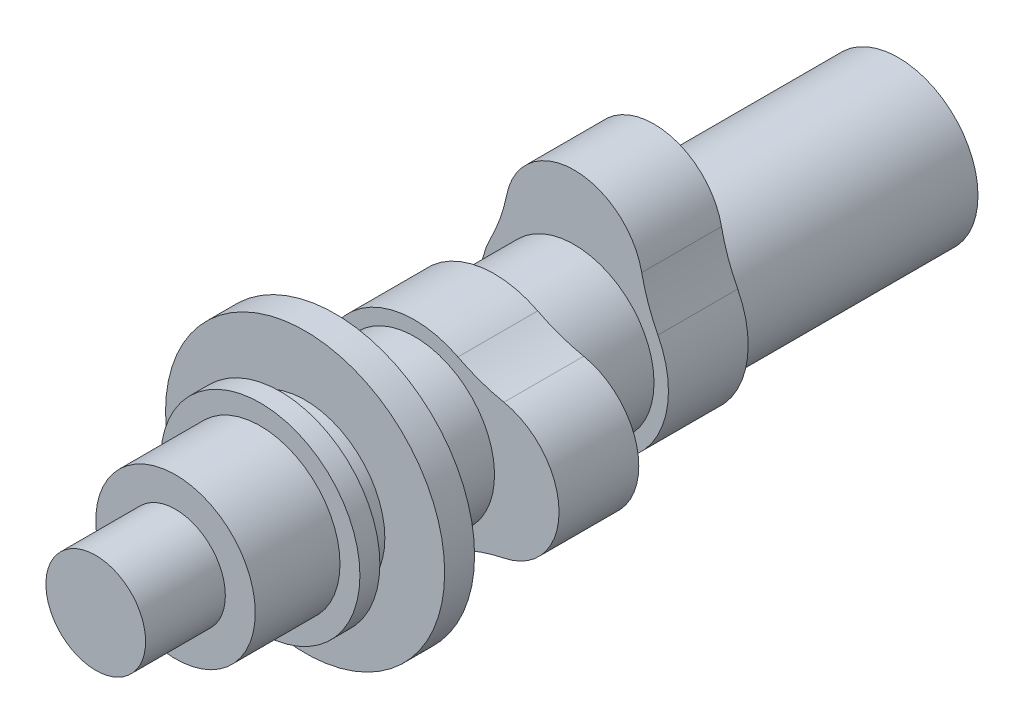
ISO-10303-21;
HEADER;
FILE_DESCRIPTION(('STEP AP214'),'2;1');
FILE_NAME('part.step','',(''),(''),'','','');
FILE_SCHEMA(('AUTOMOTIVE_DESIGN { 1 0 10303 214 1 1 1 1 }'));
ENDSEC;
DATA;
#1=APPLICATION_CONTEXT('core data for automotive mechanical design processes');
#2=APPLICATION_PROTOCOL_DEFINITION('international standard','automotive_design',2000,#1);
#3=PRODUCT_CONTEXT('',#1,'mechanical');
#4=PRODUCT('Part','Part','',(#3));
#5=PRODUCT_RELATED_PRODUCT_CATEGORY('part','',(#4));
#6=PRODUCT_DEFINITION_FORMATION('','',#4);
#7=PRODUCT_DEFINITION_CONTEXT('part definition',#1,'design');
#8=PRODUCT_DEFINITION('design','',#6,#7);
#9=PRODUCT_DEFINITION_SHAPE('','',#8);
#10=(LENGTH_UNIT() NAMED_UNIT(*) SI_UNIT(.MILLI.,.METRE.));
#11=(NAMED_UNIT(*) PLANE_ANGLE_UNIT() SI_UNIT($,.RADIAN.));
#12=(NAMED_UNIT(*) SI_UNIT($,.STERADIAN.) SOLID_ANGLE_UNIT());
#13=UNCERTAINTY_MEASURE_WITH_UNIT(LENGTH_MEASURE(1.E-05),#10,'distance_accuracy_value','');
#14=(GEOMETRIC_REPRESENTATION_CONTEXT(3) GLOBAL_UNCERTAINTY_ASSIGNED_CONTEXT((#13)) GLOBAL_UNIT_ASSIGNED_CONTEXT((#10,
#11,#12)) REPRESENTATION_CONTEXT('',''));
#15=CARTESIAN_POINT('',(0.,0.,0.));
#16=DIRECTION('',(0.,0.,1.));
#17=DIRECTION('',(1.,0.,0.));
#18=AXIS2_PLACEMENT_3D('',#15,#16,#17);
#19=CARTESIAN_POINT('',(0.,0.,76.2));
#20=DIRECTION('',(0.,0.,-1.));
#21=DIRECTION('',(-1.,0.,0.));
#22=AXIS2_PLACEMENT_3D('',#19,#20,#21);
#23=CYLINDRICAL_SURFACE('',#22,12.7);
#24=CARTESIAN_POINT('',(0.,0.,55.5625));
#25=DIRECTION('',(0.,0.,1.));
#26=DIRECTION('',(1.,0.,0.));
#27=AXIS2_PLACEMENT_3D('',#24,#25,#26);
#28=CIRCLE('',#27,12.7);
#29=CARTESIAN_POINT('',(12.7,0.,55.5625));
#30=VERTEX_POINT('',#29);
#31=EDGE_CURVE('E182',#30,#30,#28,.T.);
#32=ORIENTED_EDGE('',*,*,#31,.T.);
#33=EDGE_LOOP('',(#32));
#34=FACE_BOUND('',#33,.T.);
#35=CARTESIAN_POINT('',(0.,0.,59.53125));
#36=DIRECTION('',(0.,0.,1.));
#37=DIRECTION('',(1.,0.,0.));
#38=AXIS2_PLACEMENT_3D('',#35,#36,#37);
#39=CIRCLE('',#38,12.7);
#40=CARTESIAN_POINT('',(12.7,0.,59.53125));
#41=VERTEX_POINT('',#40);
#42=EDGE_CURVE('E37',#41,#41,#39,.T.);
#43=ORIENTED_EDGE('',*,*,#42,.F.);
#44=EDGE_LOOP('',(#43));
#45=FACE_BOUND('',#44,.T.);
#46=ADVANCED_FACE('F33',(#34,#45),#23,.T.);
#47=CARTESIAN_POINT('',(0.,0.,38.0999999999998));
#48=DIRECTION('',(0.,0.,1.));
#49=DIRECTION('',(0.,-1.,0.));
#50=AXIS2_PLACEMENT_3D('',#47,#48,#49);
#51=CIRCLE('',#50,12.7);
#52=CARTESIAN_POINT('',(0.,-12.7,38.0999999999996));
#53=VERTEX_POINT('',#52);
#54=EDGE_CURVE('E135',#53,#53,#51,.T.);
#55=ORIENTED_EDGE('',*,*,#54,.T.);
#56=EDGE_LOOP('',(#55));
#57=FACE_BOUND('',#56,.T.);
#58=CARTESIAN_POINT('',(0.,0.,50.8));
#59=DIRECTION('',(0.,0.,1.));
#60=DIRECTION('',(1.,0.,0.));
#61=AXIS2_PLACEMENT_3D('',#58,#59,#60);
#62=CIRCLE('',#61,12.7);
#63=CARTESIAN_POINT('',(12.7,0.,50.8));
#64=VERTEX_POINT('',#63);
#65=EDGE_CURVE('E178',#64,#64,#62,.T.);
#66=ORIENTED_EDGE('',*,*,#65,.F.);
#67=EDGE_LOOP('',(#66));
#68=FACE_BOUND('',#67,.T.);
#69=ADVANCED_FACE('F233',(#57,#68),#23,.T.);
#70=CARTESIAN_POINT('',(0.,0.,12.7));
#71=DIRECTION('',(0.,0.,1.));
#72=DIRECTION('',(1.,0.,0.));
#73=AXIS2_PLACEMENT_3D('',#70,#71,#72);
#74=CIRCLE('',#73,12.7);
#75=CARTESIAN_POINT('',(12.7,0.,12.7));
#76=VERTEX_POINT('',#75);
#77=EDGE_CURVE('E149',#76,#76,#74,.F.);
#78=ORIENTED_EDGE('',*,*,#77,.F.);
#79=EDGE_LOOP('',(#78));
#80=FACE_BOUND('',#79,.T.);
#81=CARTESIAN_POINT('',(0.,0.,25.3999999999998));
#82=DIRECTION('',(0.,0.,1.));
#83=DIRECTION('',(0.,-1.,0.));
#84=AXIS2_PLACEMENT_3D('',#81,#82,#83);
#85=CIRCLE('',#84,12.7);
#86=CARTESIAN_POINT('',(0.,-12.7,25.3999999999996));
#87=VERTEX_POINT('',#86);
#88=EDGE_CURVE('E176',#87,#87,#85,.T.);
#89=ORIENTED_EDGE('',*,*,#88,.F.);
#90=EDGE_LOOP('',(#89));
#91=FACE_BOUND('',#90,.T.);
#92=ADVANCED_FACE('F240',(#80,#91),#23,.T.);
#93=CARTESIAN_POINT('',(0.,12.0052209070083,12.7));
#94=DIRECTION('',(0.,0.,-1.));
#95=DIRECTION('',(-1.,0.,0.));
#96=AXIS2_PLACEMENT_3D('',#93,#94,#95);
#97=CYLINDRICAL_SURFACE('',#96,10.9690790929917);
#98=CARTESIAN_POINT('',(0.,12.0052209070083,0.));
#99=DIRECTION('',(0.,0.,1.));
#100=DIRECTION('',(1.,0.,0.));
#101=AXIS2_PLACEMENT_3D('',#98,#99,#100);
#102=CIRCLE('',#101,10.9690790929917);
#103=CARTESIAN_POINT('',(10.7465616100147,14.2034269279413,0.));
#104=VERTEX_POINT('',#103);
#105=CARTESIAN_POINT('',(-10.7465616100147,14.2034269279413,0.));
#106=VERTEX_POINT('',#105);
#107=EDGE_CURVE('E152',#104,#106,#102,.T.);
#108=ORIENTED_EDGE('',*,*,#107,.T.);
#109=DIRECTION('',(0.,0.,-1.));
#110=VECTOR('',#109,1.);
#111=CARTESIAN_POINT('',(-10.7465616100147,14.2034269279413,12.7));
#112=LINE('',#111,#110);
#113=CARTESIAN_POINT('',(-10.7465616100147,14.2034269279413,12.7));
#114=VERTEX_POINT('',#113);
#115=EDGE_CURVE('E171',#114,#106,#112,.T.);
#116=ORIENTED_EDGE('',*,*,#115,.F.);
#117=CARTESIAN_POINT('',(0.,12.0052209070083,12.7));
#118=DIRECTION('',(0.,0.,1.));
#119=DIRECTION('',(1.,0.,0.));
#120=AXIS2_PLACEMENT_3D('',#117,#118,#119);
#121=CIRCLE('',#120,10.9690790929917);
#122=CARTESIAN_POINT('',(10.7465616100147,14.2034269279413,12.7));
#123=VERTEX_POINT('',#122);
#124=EDGE_CURVE('E153',#123,#114,#121,.T.);
#125=ORIENTED_EDGE('',*,*,#124,.F.);
#126=DIRECTION('',(0.,0.,-1.));
#127=VECTOR('',#126,1.);
#128=CARTESIAN_POINT('',(10.7465616100147,14.2034269279413,12.7));
#129=LINE('',#128,#127);
#130=EDGE_CURVE('E159',#123,#104,#129,.T.);
#131=ORIENTED_EDGE('',*,*,#130,.T.);
#132=EDGE_LOOP('',(#108,#116,#125,#131));
#133=FACE_BOUND('',#132,.T.);
#134=ADVANCED_FACE('F35',(#133),#97,.T.);
#135=CARTESIAN_POINT('',(-38.5809051714069,19.8969337281399,12.7));
#136=DIRECTION('',(0.,0.,-1.));
#137=DIRECTION('',(-1.,0.,0.));
#138=AXIS2_PLACEMENT_3D('',#135,#136,#137);
#139=CYLINDRICAL_SURFACE('',#138,28.4106793508625);
#140=CARTESIAN_POINT('',(-38.5809051714069,19.8969337281399,0.));
#141=DIRECTION('',(0.,0.,-1.));
#142=DIRECTION('',(-1.,0.,0.));
#143=AXIS2_PLACEMENT_3D('',#140,#141,#142);
#144=CIRCLE('',#143,28.4106793508625);
#145=CARTESIAN_POINT('',(-13.3303776982677,6.87473869405422,0.));
#146=VERTEX_POINT('',#145);
#147=EDGE_CURVE('E162',#106,#146,#144,.T.);
#148=ORIENTED_EDGE('',*,*,#147,.T.);
#149=DIRECTION('',(0.,0.,-1.));
#150=VECTOR('',#149,1.);
#151=CARTESIAN_POINT('',(-13.3303776982677,6.87473869405422,12.7));
#152=LINE('',#151,#150);
#153=CARTESIAN_POINT('',(-13.3303776982677,6.87473869405422,12.7));
#154=VERTEX_POINT('',#153);
#155=EDGE_CURVE('E169',#154,#146,#152,.T.);
#156=ORIENTED_EDGE('',*,*,#155,.F.);
#157=CARTESIAN_POINT('',(-38.5809051714069,19.8969337281399,12.7));
#158=DIRECTION('',(0.,0.,-1.));
#159=DIRECTION('',(-1.,0.,0.));
#160=AXIS2_PLACEMENT_3D('',#157,#158,#159);
#161=CIRCLE('',#160,28.4106793508625);
#162=EDGE_CURVE('E83',#114,#154,#161,.T.);
#163=ORIENTED_EDGE('',*,*,#162,.F.);
#164=ORIENTED_EDGE('',*,*,#115,.T.);
#165=EDGE_LOOP('',(#148,#156,#163,#164));
#166=FACE_BOUND('',#165,.T.);
#167=ADVANCED_FACE('F276',(#166),#139,.F.);
#168=CARTESIAN_POINT('',(0.,0.,12.7));
#169=DIRECTION('',(0.,0.,-1.));
#170=DIRECTION('',(-1.,0.,0.));
#171=AXIS2_PLACEMENT_3D('',#168,#169,#170);
#172=CYLINDRICAL_SURFACE('',#171,14.9987);
#173=CARTESIAN_POINT('',(0.,0.,0.));
#174=DIRECTION('',(0.,0.,1.));
#175=DIRECTION('',(1.,0.,0.));
#176=AXIS2_PLACEMENT_3D('',#173,#174,#175);
#177=CIRCLE('',#176,14.9987);
#178=CARTESIAN_POINT('',(13.3303776982677,6.87473869405421,0.));
#179=VERTEX_POINT('',#178);
#180=EDGE_CURVE('E69',#146,#179,#177,.T.);
#181=ORIENTED_EDGE('',*,*,#180,.T.);
#182=DIRECTION('',(0.,0.,-1.));
#183=VECTOR('',#182,1.);
#184=CARTESIAN_POINT('',(13.3303776982677,6.87473869405421,12.7));
#185=LINE('',#184,#183);
#186=CARTESIAN_POINT('',(13.3303776982677,6.87473869405421,12.7));
#187=VERTEX_POINT('',#186);
#188=EDGE_CURVE('E167',#187,#179,#185,.T.);
#189=ORIENTED_EDGE('',*,*,#188,.F.);
#190=CARTESIAN_POINT('',(0.,0.,12.7));
#191=DIRECTION('',(0.,0.,1.));
#192=DIRECTION('',(1.,0.,0.));
#193=AXIS2_PLACEMENT_3D('',#190,#191,#192);
#194=CIRCLE('',#193,14.9987);
#195=EDGE_CURVE('E156',#154,#187,#194,.T.);
#196=ORIENTED_EDGE('',*,*,#195,.F.);
#197=ORIENTED_EDGE('',*,*,#155,.T.);
#198=EDGE_LOOP('',(#181,#189,#196,#197));
#199=FACE_BOUND('',#198,.T.);
#200=ADVANCED_FACE('F456',(#199),#172,.T.);
#201=CARTESIAN_POINT('',(38.5809051714069,19.8969337281399,12.7));
#202=DIRECTION('',(0.,0.,-1.));
#203=DIRECTION('',(-1.,0.,0.));
#204=AXIS2_PLACEMENT_3D('',#201,#202,#203);
#205=CYLINDRICAL_SURFACE('',#204,28.4106793508625);
#206=CARTESIAN_POINT('',(38.5809051714069,19.8969337281399,0.));
#207=DIRECTION('',(0.,0.,-1.));
#208=DIRECTION('',(1.,0.,0.));
#209=AXIS2_PLACEMENT_3D('',#206,#207,#208);
#210=CIRCLE('',#209,28.4106793508625);
#211=EDGE_CURVE('E75',#179,#104,#210,.T.);
#212=ORIENTED_EDGE('',*,*,#211,.T.);
#213=ORIENTED_EDGE('',*,*,#130,.F.);
#214=CARTESIAN_POINT('',(38.5809051714069,19.8969337281399,12.7));
#215=DIRECTION('',(0.,0.,-1.));
#216=DIRECTION('',(1.,0.,0.));
#217=AXIS2_PLACEMENT_3D('',#214,#215,#216);
#218=CIRCLE('',#217,28.4106793508625);
#219=EDGE_CURVE('E51',#187,#123,#218,.T.);
#220=ORIENTED_EDGE('',*,*,#219,.F.);
#221=ORIENTED_EDGE('',*,*,#188,.T.);
#222=EDGE_LOOP('',(#212,#213,#220,#221));
#223=FACE_BOUND('',#222,.T.);
#224=ADVANCED_FACE('F447',(#223),#205,.F.);
#225=CARTESIAN_POINT('',(-19.2904525857035,15.9510773175741,12.7));
#226=DIRECTION('',(0.,0.,1.));
#227=DIRECTION('',(1.,0.,0.));
#228=AXIS2_PLACEMENT_3D('',#225,#226,#227);
#229=PLANE('',#228);
#230=ORIENTED_EDGE('',*,*,#77,.T.);
#231=EDGE_LOOP('',(#230));
#232=FACE_BOUND('',#231,.T.);
#233=ORIENTED_EDGE('',*,*,#124,.T.);
#234=ORIENTED_EDGE('',*,*,#162,.T.);
#235=ORIENTED_EDGE('',*,*,#195,.T.);
#236=ORIENTED_EDGE('',*,*,#219,.T.);
#237=EDGE_LOOP('',(#233,#234,#235,#236));
#238=FACE_BOUND('',#237,.T.);
#239=ADVANCED_FACE('F437',(#232,#238),#229,.T.);
#240=CARTESIAN_POINT('',(-19.2904525857035,15.9510773175741,0.));
#241=DIRECTION('',(0.,0.,1.));
#242=DIRECTION('',(1.,0.,0.));
#243=AXIS2_PLACEMENT_3D('',#240,#241,#242);
#244=PLANE('',#243);
#245=CARTESIAN_POINT('',(0.,0.,0.));
#246=DIRECTION('',(0.,0.,1.));
#247=DIRECTION('',(1.,0.,0.));
#248=AXIS2_PLACEMENT_3D('',#245,#246,#247);
#249=CIRCLE('',#248,12.7);
#250=CARTESIAN_POINT('',(12.7,0.,0.));
#251=VERTEX_POINT('',#250);
#252=EDGE_CURVE('E173',#251,#251,#249,.F.);
#253=ORIENTED_EDGE('',*,*,#252,.F.);
#254=EDGE_LOOP('',(#253));
#255=FACE_BOUND('',#254,.T.);
#256=ORIENTED_EDGE('',*,*,#107,.F.);
#257=ORIENTED_EDGE('',*,*,#211,.F.);
#258=ORIENTED_EDGE('',*,*,#180,.F.);
#259=ORIENTED_EDGE('',*,*,#147,.F.);
#260=EDGE_LOOP('',(#256,#257,#258,#259));
#261=FACE_BOUND('',#260,.T.);
#262=ADVANCED_FACE('F267',(#255,#261),#244,.F.);
#263=CARTESIAN_POINT('',(0.,0.,-38.89375));
#264=DIRECTION('',(0.,0.,1.));
#265=DIRECTION('',(1.,0.,0.));
#266=AXIS2_PLACEMENT_3D('',#263,#264,#265);
#267=PLANE('',#266);
#268=CARTESIAN_POINT('',(0.,0.,-38.89375));
#269=DIRECTION('',(0.,0.,1.));
#270=DIRECTION('',(1.,0.,0.));
#271=AXIS2_PLACEMENT_3D('',#268,#269,#270);
#272=CIRCLE('',#271,12.7);
#273=CARTESIAN_POINT('',(12.7,0.,-38.89375));
#274=VERTEX_POINT('',#273);
#275=EDGE_CURVE('E138',#274,#274,#272,.T.);
#276=ORIENTED_EDGE('',*,*,#275,.F.);
#277=EDGE_LOOP('',(#276));
#278=FACE_BOUND('',#277,.T.);
#279=ADVANCED_FACE('F260',(#278),#267,.F.);
#280=ORIENTED_EDGE('',*,*,#275,.T.);
#281=EDGE_LOOP('',(#280));
#282=FACE_BOUND('',#281,.T.);
#283=ORIENTED_EDGE('',*,*,#252,.T.);
#284=EDGE_LOOP('',(#283));
#285=FACE_BOUND('',#284,.T.);
#286=ADVANCED_FACE('F248',(#282,#285),#23,.T.);
#287=CARTESIAN_POINT('',(12.0052209070083,0.,38.0999999999999));
#288=DIRECTION('',(0.,0.,-1.));
#289=DIRECTION('',(0.,1.,0.));
#290=AXIS2_PLACEMENT_3D('',#287,#288,#289);
#291=CYLINDRICAL_SURFACE('',#290,10.9690790929917);
#292=CARTESIAN_POINT('',(12.0052209070083,1.26543262044327E-13,25.3999999999998));
#293=DIRECTION('',(0.,0.,1.));
#294=DIRECTION('',(0.,-1.,0.));
#295=AXIS2_PLACEMENT_3D('',#292,#293,#294);
#296=CIRCLE('',#295,10.9690790929917);
#297=CARTESIAN_POINT('',(14.2034269279413,-10.7465616100146,25.3999999999997));
#298=VERTEX_POINT('',#297);
#299=CARTESIAN_POINT('',(14.2034269279414,10.7465616100148,25.4));
#300=VERTEX_POINT('',#299);
#301=EDGE_CURVE('E134',#298,#300,#296,.T.);
#302=ORIENTED_EDGE('',*,*,#301,.T.);
#303=DIRECTION('',(0.,0.,-1.));
#304=VECTOR('',#303,1.);
#305=CARTESIAN_POINT('',(14.2034269279414,10.7465616100147,38.1));
#306=LINE('',#305,#304);
#307=CARTESIAN_POINT('',(14.2034269279414,10.7465616100147,38.1));
#308=VERTEX_POINT('',#307);
#309=EDGE_CURVE('E114',#308,#300,#306,.T.);
#310=ORIENTED_EDGE('',*,*,#309,.F.);
#311=CARTESIAN_POINT('',(12.0052209070083,0.,38.0999999999999));
#312=DIRECTION('',(0.,0.,1.));
#313=DIRECTION('',(0.,-1.,0.));
#314=AXIS2_PLACEMENT_3D('',#311,#312,#313);
#315=CIRCLE('',#314,10.9690790929917);
#316=CARTESIAN_POINT('',(14.2034269279413,-10.7465616100148,38.0999999999997));
#317=VERTEX_POINT('',#316);
#318=EDGE_CURVE('E121',#317,#308,#315,.T.);
#319=ORIENTED_EDGE('',*,*,#318,.F.);
#320=DIRECTION('',(0.,0.,-1.));
#321=VECTOR('',#320,1.);
#322=CARTESIAN_POINT('',(14.2034269279413,-10.7465616100148,38.0999999999997));
#323=LINE('',#322,#321);
#324=EDGE_CURVE('E207',#317,#298,#323,.T.);
#325=ORIENTED_EDGE('',*,*,#324,.T.);
#326=EDGE_LOOP('',(#302,#310,#319,#325));
#327=FACE_BOUND('',#326,.T.);
#328=ADVANCED_FACE('F132',(#327),#291,.T.);
#329=CARTESIAN_POINT('',(19.8969337281401,38.5809051714069,38.1000000000004));
#330=DIRECTION('',(0.,0.,-1.));
#331=DIRECTION('',(0.,1.,0.));
#332=AXIS2_PLACEMENT_3D('',#329,#330,#331);
#333=CYLINDRICAL_SURFACE('',#332,28.4106793508625);
#334=CARTESIAN_POINT('',(19.8969337281401,38.580905171407,25.4000000000004));
#335=DIRECTION('',(0.,0.,-1.));
#336=DIRECTION('',(0.,1.,0.));
#337=AXIS2_PLACEMENT_3D('',#334,#335,#336);
#338=CIRCLE('',#337,28.4106793508625);
#339=CARTESIAN_POINT('',(6.87473869405431,13.3303776982679,25.4));
#340=VERTEX_POINT('',#339);
#341=EDGE_CURVE('E209',#300,#340,#338,.T.);
#342=ORIENTED_EDGE('',*,*,#341,.T.);
#343=DIRECTION('',(0.,0.,-1.));
#344=VECTOR('',#343,1.);
#345=CARTESIAN_POINT('',(6.87473869405427,13.3303776982677,38.1));
#346=LINE('',#345,#344);
#347=CARTESIAN_POINT('',(6.87473869405427,13.3303776982677,38.1));
#348=VERTEX_POINT('',#347);
#349=EDGE_CURVE('E117',#348,#340,#346,.T.);
#350=ORIENTED_EDGE('',*,*,#349,.F.);
#351=CARTESIAN_POINT('',(19.8969337281401,38.5809051714069,38.1000000000004));
#352=DIRECTION('',(0.,0.,-1.));
#353=DIRECTION('',(0.,1.,0.));
#354=AXIS2_PLACEMENT_3D('',#351,#352,#353);
#355=CIRCLE('',#354,28.4106793508625);
#356=EDGE_CURVE('E110',#308,#348,#355,.T.);
#357=ORIENTED_EDGE('',*,*,#356,.F.);
#358=ORIENTED_EDGE('',*,*,#309,.T.);
#359=EDGE_LOOP('',(#342,#350,#357,#358));
#360=FACE_BOUND('',#359,.T.);
#361=ADVANCED_FACE('F112',(#360),#333,.F.);
#362=CARTESIAN_POINT('',(0.,0.,38.0999999999998));
#363=DIRECTION('',(0.,0.,-1.));
#364=DIRECTION('',(0.,1.,0.));
#365=AXIS2_PLACEMENT_3D('',#362,#363,#364);
#366=CYLINDRICAL_SURFACE('',#365,14.9987);
#367=CARTESIAN_POINT('',(0.,1.74339709335669E-13,25.3999999999998));
#368=DIRECTION('',(0.,0.,1.));
#369=DIRECTION('',(0.,-1.,0.));
#370=AXIS2_PLACEMENT_3D('',#367,#368,#369);
#371=CIRCLE('',#370,14.9987);
#372=CARTESIAN_POINT('',(6.87473869405419,-13.3303776982676,25.3999999999997));
#373=VERTEX_POINT('',#372);
#374=EDGE_CURVE('E211',#340,#373,#371,.T.);
#375=ORIENTED_EDGE('',*,*,#374,.T.);
#376=DIRECTION('',(0.,0.,-1.));
#377=VECTOR('',#376,1.);
#378=CARTESIAN_POINT('',(6.87473869405415,-13.3303776982678,38.0999999999996));
#379=LINE('',#378,#377);
#380=CARTESIAN_POINT('',(6.87473869405415,-13.3303776982678,38.0999999999996));
#381=VERTEX_POINT('',#380);
#382=EDGE_CURVE('E140',#381,#373,#379,.T.);
#383=ORIENTED_EDGE('',*,*,#382,.F.);
#384=CARTESIAN_POINT('',(0.,0.,38.0999999999998));
#385=DIRECTION('',(0.,0.,1.));
#386=DIRECTION('',(0.,-1.,0.));
#387=AXIS2_PLACEMENT_3D('',#384,#385,#386);
#388=CIRCLE('',#387,14.9987);
#389=EDGE_CURVE('E120',#348,#381,#388,.T.);
#390=ORIENTED_EDGE('',*,*,#389,.F.);
#391=ORIENTED_EDGE('',*,*,#349,.T.);
#392=EDGE_LOOP('',(#375,#383,#390,#391));
#393=FACE_BOUND('',#392,.T.);
#394=ADVANCED_FACE('F223',(#393),#366,.T.);
#395=CARTESIAN_POINT('',(19.8969337281398,-38.580905171407,38.0999999999993));
#396=DIRECTION('',(0.,0.,-1.));
#397=DIRECTION('',(0.,1.,0.));
#398=AXIS2_PLACEMENT_3D('',#395,#396,#397);
#399=CYLINDRICAL_SURFACE('',#398,28.4106793508625);
#400=CARTESIAN_POINT('',(19.8969337281398,-38.5809051714068,25.3999999999993));
#401=DIRECTION('',(0.,0.,-1.));
#402=DIRECTION('',(0.,-1.,0.));
#403=AXIS2_PLACEMENT_3D('',#400,#401,#402);
#404=CIRCLE('',#403,28.4106793508625);
#405=EDGE_CURVE('E130',#373,#298,#404,.T.);
#406=ORIENTED_EDGE('',*,*,#405,.T.);
#407=ORIENTED_EDGE('',*,*,#324,.F.);
#408=CARTESIAN_POINT('',(19.8969337281398,-38.580905171407,38.0999999999993));
#409=DIRECTION('',(0.,0.,-1.));
#410=DIRECTION('',(0.,-1.,0.));
#411=AXIS2_PLACEMENT_3D('',#408,#409,#410);
#412=CIRCLE('',#411,28.4106793508625);
#413=EDGE_CURVE('E126',#381,#317,#412,.T.);
#414=ORIENTED_EDGE('',*,*,#413,.F.);
#415=ORIENTED_EDGE('',*,*,#382,.T.);
#416=EDGE_LOOP('',(#406,#407,#414,#415));
#417=FACE_BOUND('',#416,.T.);
#418=ADVANCED_FACE('F218',(#417),#399,.F.);
#419=CARTESIAN_POINT('',(15.9510773175742,19.2904525857034,38.1000000000001));
#420=DIRECTION('',(0.,0.,1.));
#421=DIRECTION('',(0.,-1.,0.));
#422=AXIS2_PLACEMENT_3D('',#419,#420,#421);
#423=PLANE('',#422);
#424=ORIENTED_EDGE('',*,*,#54,.F.);
#425=EDGE_LOOP('',(#424));
#426=FACE_BOUND('',#425,.T.);
#427=ORIENTED_EDGE('',*,*,#318,.T.);
#428=ORIENTED_EDGE('',*,*,#356,.T.);
#429=ORIENTED_EDGE('',*,*,#389,.T.);
#430=ORIENTED_EDGE('',*,*,#413,.T.);
#431=EDGE_LOOP('',(#427,#428,#429,#430));
#432=FACE_BOUND('',#431,.T.);
#433=ADVANCED_FACE('F124',(#426,#432),#423,.T.);
#434=CARTESIAN_POINT('',(15.9510773175742,19.2904525857036,25.4000000000001));
#435=DIRECTION('',(0.,0.,1.));
#436=DIRECTION('',(0.,-1.,0.));
#437=AXIS2_PLACEMENT_3D('',#434,#435,#436);
#438=PLANE('',#437);
#439=ORIENTED_EDGE('',*,*,#88,.T.);
#440=EDGE_LOOP('',(#439));
#441=FACE_BOUND('',#440,.T.);
#442=ORIENTED_EDGE('',*,*,#301,.F.);
#443=ORIENTED_EDGE('',*,*,#405,.F.);
#444=ORIENTED_EDGE('',*,*,#374,.F.);
#445=ORIENTED_EDGE('',*,*,#341,.F.);
#446=EDGE_LOOP('',(#442,#443,#444,#445));
#447=FACE_BOUND('',#446,.T.);
#448=ADVANCED_FACE('F222',(#441,#447),#438,.F.);
#449=CARTESIAN_POINT('',(0.,0.,55.5625));
#450=DIRECTION('',(0.,0.,-1.));
#451=DIRECTION('',(-1.,0.,0.));
#452=AXIS2_PLACEMENT_3D('',#449,#450,#451);
#453=CYLINDRICAL_SURFACE('',#452,22.225);
#454=CARTESIAN_POINT('',(0.,0.,55.5625));
#455=DIRECTION('',(0.,0.,1.));
#456=DIRECTION('',(1.,0.,0.));
#457=AXIS2_PLACEMENT_3D('',#454,#455,#456);
#458=CIRCLE('',#457,22.225);
#459=CARTESIAN_POINT('',(-22.225,0.,55.5625));
#460=VERTEX_POINT('',#459);
#461=EDGE_CURVE('E184',#460,#460,#458,.T.);
#462=CARTESIAN_POINT('',(0.,0.,50.8));
#463=DIRECTION('',(0.,0.,1.));
#464=DIRECTION('',(1.,0.,0.));
#465=AXIS2_PLACEMENT_3D('',#462,#463,#464);
#466=CIRCLE('',#465,22.225);
#467=CARTESIAN_POINT('',(-22.225,0.,50.8));
#468=VERTEX_POINT('',#467);
#469=EDGE_CURVE('E187',#468,#468,#466,.T.);
#470=CARTESIAN_POINT('',(-22.225,0.,55.5625));
#471=CARTESIAN_POINT('',(-22.225,0.,55.512890625));
#472=CARTESIAN_POINT('',(-22.225,0.,55.46328125));
#473=CARTESIAN_POINT('',(-22.225,0.,55.3640625));
#474=CARTESIAN_POINT('',(-22.225,0.,55.314453125));
#475=CARTESIAN_POINT('',(-22.225,0.,55.215234375));
#476=CARTESIAN_POINT('',(-22.225,0.,55.165625));
#477=CARTESIAN_POINT('',(-22.225,0.,55.06640625));
#478=CARTESIAN_POINT('',(-22.225,0.,55.016796875));
#479=CARTESIAN_POINT('',(-22.225,0.,54.917578125));
#480=CARTESIAN_POINT('',(-22.225,0.,54.86796875));
#481=CARTESIAN_POINT('',(-22.225,0.,54.76875));
#482=CARTESIAN_POINT('',(-22.225,0.,54.719140625));
#483=CARTESIAN_POINT('',(-22.225,0.,54.619921875));
#484=CARTESIAN_POINT('',(-22.225,0.,54.5703125));
#485=CARTESIAN_POINT('',(-22.225,0.,54.47109375));
#486=CARTESIAN_POINT('',(-22.225,0.,54.421484375));
#487=CARTESIAN_POINT('',(-22.225,0.,54.322265625));
#488=CARTESIAN_POINT('',(-22.225,0.,54.27265625));
#489=CARTESIAN_POINT('',(-22.225,0.,54.1734375));
#490=CARTESIAN_POINT('',(-22.225,0.,54.123828125));
#491=CARTESIAN_POINT('',(-22.225,0.,54.024609375));
#492=CARTESIAN_POINT('',(-22.225,0.,53.975));
#493=CARTESIAN_POINT('',(-22.225,0.,53.87578125));
#494=CARTESIAN_POINT('',(-22.225,0.,53.826171875));
#495=CARTESIAN_POINT('',(-22.225,0.,53.726953125));
#496=CARTESIAN_POINT('',(-22.225,0.,53.67734375));
#497=CARTESIAN_POINT('',(-22.225,0.,53.578125));
#498=CARTESIAN_POINT('',(-22.225,0.,53.528515625));
#499=CARTESIAN_POINT('',(-22.225,0.,53.429296875));
#500=CARTESIAN_POINT('',(-22.225,0.,53.3796875));
#501=CARTESIAN_POINT('',(-22.225,0.,53.28046875));
#502=CARTESIAN_POINT('',(-22.225,0.,53.230859375));
#503=CARTESIAN_POINT('',(-22.225,0.,53.131640625));
#504=CARTESIAN_POINT('',(-22.225,0.,53.08203125));
#505=CARTESIAN_POINT('',(-22.225,0.,52.9828125));
#506=CARTESIAN_POINT('',(-22.225,0.,52.933203125));
#507=CARTESIAN_POINT('',(-22.225,0.,52.833984375));
#508=CARTESIAN_POINT('',(-22.225,0.,52.784375));
#509=CARTESIAN_POINT('',(-22.225,0.,52.68515625));
#510=CARTESIAN_POINT('',(-22.225,0.,52.635546875));
#511=CARTESIAN_POINT('',(-22.225,0.,52.536328125));
#512=CARTESIAN_POINT('',(-22.225,0.,52.48671875));
#513=CARTESIAN_POINT('',(-22.225,0.,52.3875));
#514=CARTESIAN_POINT('',(-22.225,0.,52.337890625));
#515=CARTESIAN_POINT('',(-22.225,0.,52.238671875));
#516=CARTESIAN_POINT('',(-22.225,0.,52.1890625));
#517=CARTESIAN_POINT('',(-22.225,0.,52.08984375));
#518=CARTESIAN_POINT('',(-22.225,0.,52.040234375));
#519=CARTESIAN_POINT('',(-22.225,0.,51.941015625));
#520=CARTESIAN_POINT('',(-22.225,0.,51.89140625));
#521=CARTESIAN_POINT('',(-22.225,0.,51.7921875));
#522=CARTESIAN_POINT('',(-22.225,0.,51.742578125));
#523=CARTESIAN_POINT('',(-22.225,0.,51.643359375));
#524=CARTESIAN_POINT('',(-22.225,0.,51.59375));
#525=CARTESIAN_POINT('',(-22.225,0.,51.49453125));
#526=CARTESIAN_POINT('',(-22.225,0.,51.444921875));
#527=CARTESIAN_POINT('',(-22.225,0.,51.345703125));
#528=CARTESIAN_POINT('',(-22.225,0.,51.29609375));
#529=CARTESIAN_POINT('',(-22.225,0.,51.196875));
#530=CARTESIAN_POINT('',(-22.225,0.,51.147265625));
#531=CARTESIAN_POINT('',(-22.225,0.,51.048046875));
#532=CARTESIAN_POINT('',(-22.225,0.,50.9984375));
#533=CARTESIAN_POINT('',(-22.225,0.,50.89921875));
#534=CARTESIAN_POINT('',(-22.225,0.,50.849609375));
#535=CARTESIAN_POINT('',(-22.225,0.,50.8));
#536=B_SPLINE_CURVE_WITH_KNOTS('',3,(#470,#471,#472,#473,#474,#475,#476,#477,#478,#479,#480,
#481,#482,#483,#484,#485,#486,#487,#488,#489,#490,#491,#492,#493,#494,#495,#496,#497,#498,#499,
#500,#501,#502,#503,#504,#505,#506,#507,#508,#509,#510,#511,#512,#513,#514,#515,#516,#517,#518,
#519,#520,#521,#522,#523,#524,#525,#526,#527,#528,#529,#530,#531,#532,#533,#534,#535),
.UNSPECIFIED.,.F.,.F.,(4,2,2,2,2,2,2,2,2,2,2,2,2,2,2,2,2,2,2,2,2,2,2,2,2,2,2,2,2,2,2,2,4),(0.,
0.148828125,0.29765625,0.446484375,0.5953125,0.744140625,0.892968750000001,1.041796875,1.190625,
1.339453125,1.48828125,1.637109375,1.7859375,1.934765625,2.08359375,2.232421875,2.38125,
2.530078125,2.67890625,2.827734375,2.9765625,3.125390625,3.27421875,3.423046875,3.571875,
3.720703125,3.86953125,4.018359375,4.1671875,4.316015625,4.46484375,4.613671875,4.7625),.UNSPECIFIED.);
#537=EDGE_CURVE('BSEAM283',#460,#468,#536,.T.);
#538=ORIENTED_EDGE('',*,*,#461,.F.);
#539=ORIENTED_EDGE('',*,*,#469,.T.);
#540=ORIENTED_EDGE('',*,*,#537,.T.);
#541=ORIENTED_EDGE('',*,*,#537,.F.);
#542=EDGE_LOOP('',(#538,#540,#539,#541));
#543=FACE_BOUND('',#542,.T.);
#544=ADVANCED_FACE('F283',(#543),#453,.T.);
#545=CARTESIAN_POINT('',(0.,0.,55.5625));
#546=DIRECTION('',(0.,0.,1.));
#547=DIRECTION('',(1.,0.,0.));
#548=AXIS2_PLACEMENT_3D('',#545,#546,#547);
#549=PLANE('',#548);
#550=ORIENTED_EDGE('',*,*,#31,.F.);
#551=EDGE_LOOP('',(#550));
#552=FACE_BOUND('',#551,.T.);
#553=ORIENTED_EDGE('',*,*,#461,.T.);
#554=EDGE_LOOP('',(#553));
#555=FACE_BOUND('',#554,.T.);
#556=ADVANCED_FACE('F289',(#552,#555),#549,.T.);
#557=CARTESIAN_POINT('',(0.,0.,50.8));
#558=DIRECTION('',(0.,0.,1.));
#559=DIRECTION('',(1.,0.,0.));
#560=AXIS2_PLACEMENT_3D('',#557,#558,#559);
#561=PLANE('',#560);
#562=ORIENTED_EDGE('',*,*,#65,.T.);
#563=EDGE_LOOP('',(#562));
#564=FACE_BOUND('',#563,.T.);
#565=ORIENTED_EDGE('',*,*,#469,.F.);
#566=EDGE_LOOP('',(#565));
#567=FACE_BOUND('',#566,.T.);
#568=ADVANCED_FACE('F295',(#564,#567),#561,.F.);
#569=CARTESIAN_POINT('',(0.,0.,59.53125));
#570=DIRECTION('',(0.,0.,1.));
#571=DIRECTION('',(1.,0.,0.));
#572=AXIS2_PLACEMENT_3D('',#569,#570,#571);
#573=CYLINDRICAL_SURFACE('',#572,15.875);
#574=CARTESIAN_POINT('',(0.,0.,59.53125));
#575=DIRECTION('',(0.,0.,1.));
#576=DIRECTION('',(1.,0.,0.));
#577=AXIS2_PLACEMENT_3D('',#574,#575,#576);
#578=CIRCLE('',#577,15.875);
#579=CARTESIAN_POINT('',(15.875,0.,59.53125));
#580=VERTEX_POINT('',#579);
#581=EDGE_CURVE('E188',#580,#580,#578,.T.);
#582=ORIENTED_EDGE('',*,*,#581,.T.);
#583=EDGE_LOOP('',(#582));
#584=FACE_BOUND('',#583,.T.);
#585=CARTESIAN_POINT('',(0.,0.,62.70625));
#586=DIRECTION('',(0.,0.,1.));
#587=DIRECTION('',(1.,0.,0.));
#588=AXIS2_PLACEMENT_3D('',#585,#586,#587);
#589=CIRCLE('',#588,15.875);
#590=CARTESIAN_POINT('',(15.875,0.,62.70625));
#591=VERTEX_POINT('',#590);
#592=EDGE_CURVE('E194',#591,#591,#589,.T.);
#593=ORIENTED_EDGE('',*,*,#592,.F.);
#594=EDGE_LOOP('',(#593));
#595=FACE_BOUND('',#594,.T.);
#596=ADVANCED_FACE('F298',(#584,#595),#573,.T.);
#597=CARTESIAN_POINT('',(0.,0.,59.53125));
#598=DIRECTION('',(0.,0.,1.));
#599=DIRECTION('',(1.,0.,0.));
#600=AXIS2_PLACEMENT_3D('',#597,#598,#599);
#601=PLANE('',#600);
#602=ORIENTED_EDGE('',*,*,#42,.T.);
#603=EDGE_LOOP('',(#602));
#604=FACE_BOUND('',#603,.T.);
#605=ORIENTED_EDGE('',*,*,#581,.F.);
#606=EDGE_LOOP('',(#605));
#607=FACE_BOUND('',#606,.T.);
#608=ADVANCED_FACE('F305',(#604,#607),#601,.F.);
#609=CARTESIAN_POINT('',(0.,0.,62.70625));
#610=DIRECTION('',(0.,0.,1.));
#611=DIRECTION('',(1.,0.,0.));
#612=AXIS2_PLACEMENT_3D('',#609,#610,#611);
#613=PLANE('',#612);
#614=CARTESIAN_POINT('',(0.,0.,62.70625));
#615=DIRECTION('',(0.,0.,1.));
#616=DIRECTION('',(1.,0.,0.));
#617=AXIS2_PLACEMENT_3D('',#614,#615,#616);
#618=CIRCLE('',#617,12.7);
#619=CARTESIAN_POINT('',(12.7,0.,62.70625));
#620=VERTEX_POINT('',#619);
#621=EDGE_CURVE('E185',#620,#620,#618,.T.);
#622=ORIENTED_EDGE('',*,*,#621,.F.);
#623=EDGE_LOOP('',(#622));
#624=FACE_BOUND('',#623,.T.);
#625=ORIENTED_EDGE('',*,*,#592,.T.);
#626=EDGE_LOOP('',(#625));
#627=FACE_BOUND('',#626,.T.);
#628=ADVANCED_FACE('F256',(#624,#627),#613,.T.);
#629=CARTESIAN_POINT('',(0.,0.,76.2));
#630=DIRECTION('',(0.,0.,1.));
#631=DIRECTION('',(1.,0.,0.));
#632=AXIS2_PLACEMENT_3D('',#629,#630,#631);
#633=PLANE('',#632);
#634=CARTESIAN_POINT('',(0.,0.,76.2));
#635=DIRECTION('',(0.,0.,1.));
#636=DIRECTION('',(1.,0.,0.));
#637=AXIS2_PLACEMENT_3D('',#634,#635,#636);
#638=CIRCLE('',#637,7.9375);
#639=CARTESIAN_POINT('',(7.9375,0.,76.2));
#640=VERTEX_POINT('',#639);
#641=EDGE_CURVE('E11',#640,#640,#638,.T.);
#642=ORIENTED_EDGE('',*,*,#641,.F.);
#643=EDGE_LOOP('',(#642));
#644=FACE_BOUND('',#643,.T.);
#645=CARTESIAN_POINT('',(0.,0.,76.2));
#646=DIRECTION('',(0.,0.,1.));
#647=DIRECTION('',(1.,0.,0.));
#648=AXIS2_PLACEMENT_3D('',#645,#646,#647);
#649=CIRCLE('',#648,12.7);
#650=CARTESIAN_POINT('',(12.7,0.,76.2));
#651=VERTEX_POINT('',#650);
#652=EDGE_CURVE('E146',#651,#651,#649,.T.);
#653=ORIENTED_EDGE('',*,*,#652,.T.);
#654=EDGE_LOOP('',(#653));
#655=FACE_BOUND('',#654,.T.);
#656=ADVANCED_FACE('F247',(#644,#655),#633,.T.);
#657=ORIENTED_EDGE('',*,*,#621,.T.);
#658=EDGE_LOOP('',(#657));
#659=FACE_BOUND('',#658,.T.);
#660=ORIENTED_EDGE('',*,*,#652,.F.);
#661=EDGE_LOOP('',(#660));
#662=FACE_BOUND('',#661,.T.);
#663=ADVANCED_FACE('F236',(#659,#662),#23,.T.);
#664=CARTESIAN_POINT('',(0.,0.,88.9));
#665=DIRECTION('',(0.,0.,-1.));
#666=DIRECTION('',(-1.,0.,0.));
#667=AXIS2_PLACEMENT_3D('',#664,#665,#666);
#668=CYLINDRICAL_SURFACE('',#667,7.9375);
#669=CARTESIAN_POINT('',(0.,0.,88.9));
#670=DIRECTION('',(0.,0.,1.));
#671=DIRECTION('',(1.,0.,0.));
#672=AXIS2_PLACEMENT_3D('',#669,#670,#671);
#673=CIRCLE('',#672,7.9375);
#674=CARTESIAN_POINT('',(7.9375,0.,88.9));
#675=VERTEX_POINT('',#674);
#676=EDGE_CURVE('E199',#675,#675,#673,.T.);
#677=ORIENTED_EDGE('',*,*,#676,.F.);
#678=EDGE_LOOP('',(#677));
#679=FACE_BOUND('',#678,.T.);
#680=ORIENTED_EDGE('',*,*,#641,.T.);
#681=EDGE_LOOP('',(#680));
#682=FACE_BOUND('',#681,.T.);
#683=ADVANCED_FACE('F246',(#679,#682),#668,.T.);
#684=CARTESIAN_POINT('',(0.,0.,88.9));
#685=DIRECTION('',(0.,0.,1.));
#686=DIRECTION('',(1.,0.,0.));
#687=AXIS2_PLACEMENT_3D('',#684,#685,#686);
#688=PLANE('',#687);
#689=ORIENTED_EDGE('',*,*,#676,.T.);
#690=EDGE_LOOP('',(#689));
#691=FACE_BOUND('',#690,.T.);
#692=ADVANCED_FACE('F253',(#691),#688,.T.);
#693=CLOSED_SHELL('',(#46,#69,#92,#134,#167,#200,#224,#239,#262,#279,#286,#328,#361,#394,#418,
#433,#448,#544,#556,#568,#596,#608,#628,#656,#663,#683,#692));
#694=MANIFOLD_SOLID_BREP('B2',#693);
#695=ADVANCED_BREP_SHAPE_REPRESENTATION('',(#18,#694),#14);
#696=SHAPE_DEFINITION_REPRESENTATION(#9,#695);
ENDSEC;
END-ISO-10303-21;
